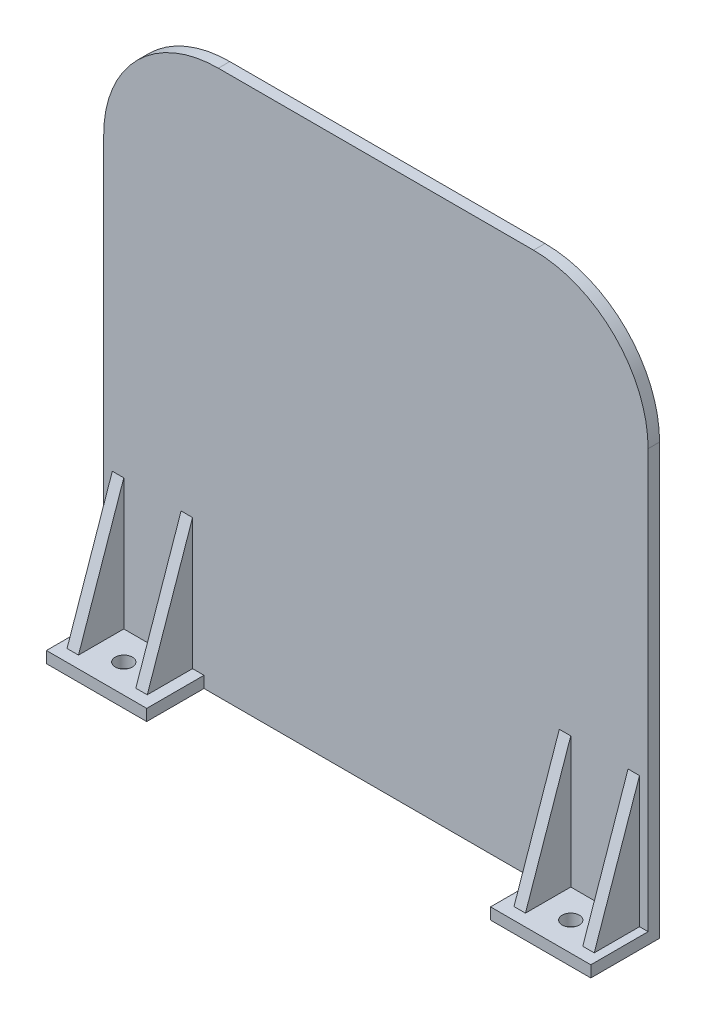
ISO-10303-21;
HEADER;
FILE_DESCRIPTION(('STEP AP214'),'2;1');
FILE_NAME('part.step','',(''),(''),'','','');
FILE_SCHEMA(('AUTOMOTIVE_DESIGN { 1 0 10303 214 1 1 1 1 }'));
ENDSEC;
DATA;
#1=APPLICATION_CONTEXT('core data for automotive mechanical design processes');
#2=APPLICATION_PROTOCOL_DEFINITION('international standard','automotive_design',2000,#1);
#3=PRODUCT_CONTEXT('',#1,'mechanical');
#4=PRODUCT('Part','Part','',(#3));
#5=PRODUCT_RELATED_PRODUCT_CATEGORY('part','',(#4));
#6=PRODUCT_DEFINITION_FORMATION('','',#4);
#7=PRODUCT_DEFINITION_CONTEXT('part definition',#1,'design');
#8=PRODUCT_DEFINITION('design','',#6,#7);
#9=PRODUCT_DEFINITION_SHAPE('','',#8);
#10=(LENGTH_UNIT() NAMED_UNIT(*) SI_UNIT(.MILLI.,.METRE.));
#11=(NAMED_UNIT(*) PLANE_ANGLE_UNIT() SI_UNIT($,.RADIAN.));
#12=(NAMED_UNIT(*) SI_UNIT($,.STERADIAN.) SOLID_ANGLE_UNIT());
#13=UNCERTAINTY_MEASURE_WITH_UNIT(LENGTH_MEASURE(1.E-05),#10,'distance_accuracy_value','');
#14=(GEOMETRIC_REPRESENTATION_CONTEXT(3) GLOBAL_UNCERTAINTY_ASSIGNED_CONTEXT((#13)) GLOBAL_UNIT_ASSIGNED_CONTEXT((#10,
#11,#12)) REPRESENTATION_CONTEXT('',''));
#15=CARTESIAN_POINT('',(0.,0.,0.));
#16=DIRECTION('',(0.,0.,1.));
#17=DIRECTION('',(1.,0.,0.));
#18=AXIS2_PLACEMENT_3D('',#15,#16,#17);
#19=CARTESIAN_POINT('',(0.,0.,2.));
#20=DIRECTION('',(0.,0.,-1.));
#21=DIRECTION('',(-1.,0.,0.));
#22=AXIS2_PLACEMENT_3D('',#19,#20,#21);
#23=PLANE('',#22);
#24=DIRECTION('',(0.,-1.,0.));
#25=VECTOR('',#24,1.);
#26=CARTESIAN_POINT('',(-46.,0.,2.));
#27=LINE('',#26,#25);
#28=CARTESIAN_POINT('',(-46.,-22.6587763218544,2.));
#29=VERTEX_POINT('',#28);
#30=CARTESIAN_POINT('',(-46.,-45.5,2.));
#31=VERTEX_POINT('',#30);
#32=EDGE_CURVE('E200',#29,#31,#27,.T.);
#33=ORIENTED_EDGE('',*,*,#32,.F.);
#34=DIRECTION('',(1.,0.,0.));
#35=VECTOR('',#34,1.);
#36=CARTESIAN_POINT('',(0.,-22.6587763218544,2.));
#37=LINE('',#36,#35);
#38=CARTESIAN_POINT('',(-44.,-22.6587763218544,2.));
#39=VERTEX_POINT('',#38);
#40=EDGE_CURVE('E206',#29,#39,#37,.T.);
#41=ORIENTED_EDGE('',*,*,#40,.T.);
#42=DIRECTION('',(0.,-1.,0.));
#43=VECTOR('',#42,1.);
#44=CARTESIAN_POINT('',(-44.,0.,2.));
#45=LINE('',#44,#43);
#46=CARTESIAN_POINT('',(-44.,-45.5,2.));
#47=VERTEX_POINT('',#46);
#48=EDGE_CURVE('E192',#39,#47,#45,.T.);
#49=ORIENTED_EDGE('',*,*,#48,.T.);
#50=DIRECTION('',(-1.,0.,0.));
#51=VECTOR('',#50,1.);
#52=CARTESIAN_POINT('',(-47.5,-45.5,2.));
#53=LINE('',#52,#51);
#54=CARTESIAN_POINT('',(-34.,-45.5,2.));
#55=VERTEX_POINT('',#54);
#56=EDGE_CURVE('E374',#55,#47,#53,.T.);
#57=ORIENTED_EDGE('',*,*,#56,.F.);
#58=DIRECTION('',(0.,-1.,0.));
#59=VECTOR('',#58,1.);
#60=CARTESIAN_POINT('',(-34.,0.,2.));
#61=LINE('',#60,#59);
#62=CARTESIAN_POINT('',(-34.,-22.6587763218544,2.));
#63=VERTEX_POINT('',#62);
#64=EDGE_CURVE('E223',#63,#55,#61,.T.);
#65=ORIENTED_EDGE('',*,*,#64,.F.);
#66=DIRECTION('',(1.,0.,0.));
#67=VECTOR('',#66,1.);
#68=CARTESIAN_POINT('',(0.,-22.6587763218544,2.));
#69=LINE('',#68,#67);
#70=CARTESIAN_POINT('',(-32.,-22.6587763218544,2.));
#71=VERTEX_POINT('',#70);
#72=EDGE_CURVE('E225',#63,#71,#69,.T.);
#73=ORIENTED_EDGE('',*,*,#72,.T.);
#74=DIRECTION('',(0.,-1.,0.));
#75=VECTOR('',#74,1.);
#76=CARTESIAN_POINT('',(-32.,0.,2.));
#77=LINE('',#76,#75);
#78=CARTESIAN_POINT('',(-32.,-45.5,2.));
#79=VERTEX_POINT('',#78);
#80=EDGE_CURVE('E219',#71,#79,#77,.T.);
#81=ORIENTED_EDGE('',*,*,#80,.T.);
#82=CARTESIAN_POINT('',(-30.,-45.5,2.));
#83=VERTEX_POINT('',#82);
#84=EDGE_CURVE('E297',#83,#79,#53,.T.);
#85=ORIENTED_EDGE('',*,*,#84,.F.);
#86=DIRECTION('',(0.,1.,0.));
#87=VECTOR('',#86,1.);
#88=CARTESIAN_POINT('',(-30.,-47.5,2.));
#89=LINE('',#88,#87);
#90=CARTESIAN_POINT('',(-30.,-47.5,2.));
#91=VERTEX_POINT('',#90);
#92=EDGE_CURVE('E265',#91,#83,#89,.T.);
#93=ORIENTED_EDGE('',*,*,#92,.F.);
#94=DIRECTION('',(-1.,0.,0.));
#95=VECTOR('',#94,1.);
#96=CARTESIAN_POINT('',(0.,-47.5,2.));
#97=LINE('',#96,#95);
#98=CARTESIAN_POINT('',(30.,-47.5,2.));
#99=VERTEX_POINT('',#98);
#100=EDGE_CURVE('E256',#99,#91,#97,.T.);
#101=ORIENTED_EDGE('',*,*,#100,.F.);
#102=DIRECTION('',(0.,1.,0.));
#103=VECTOR('',#102,1.);
#104=CARTESIAN_POINT('',(30.,-47.5,2.));
#105=LINE('',#104,#103);
#106=CARTESIAN_POINT('',(30.,-45.5,2.));
#107=VERTEX_POINT('',#106);
#108=EDGE_CURVE('E269',#99,#107,#105,.T.);
#109=ORIENTED_EDGE('',*,*,#108,.T.);
#110=CARTESIAN_POINT('',(32.,-45.5,2.));
#111=VERTEX_POINT('',#110);
#112=EDGE_CURVE('E377',#111,#107,#53,.T.);
#113=ORIENTED_EDGE('',*,*,#112,.F.);
#114=DIRECTION('',(0.,1.,0.));
#115=VECTOR('',#114,1.);
#116=CARTESIAN_POINT('',(32.,0.,2.));
#117=LINE('',#116,#115);
#118=CARTESIAN_POINT('',(32.,-22.6587763218544,2.));
#119=VERTEX_POINT('',#118);
#120=EDGE_CURVE('E346',#111,#119,#117,.T.);
#121=ORIENTED_EDGE('',*,*,#120,.T.);
#122=DIRECTION('',(-1.,0.,0.));
#123=VECTOR('',#122,1.);
#124=CARTESIAN_POINT('',(0.,-22.6587763218544,2.));
#125=LINE('',#124,#123);
#126=CARTESIAN_POINT('',(34.,-22.6587763218544,2.));
#127=VERTEX_POINT('',#126);
#128=EDGE_CURVE('E349',#127,#119,#125,.T.);
#129=ORIENTED_EDGE('',*,*,#128,.F.);
#130=DIRECTION('',(0.,1.,0.));
#131=VECTOR('',#130,1.);
#132=CARTESIAN_POINT('',(34.,0.,2.));
#133=LINE('',#132,#131);
#134=CARTESIAN_POINT('',(34.,-45.5,2.));
#135=VERTEX_POINT('',#134);
#136=EDGE_CURVE('E352',#135,#127,#133,.T.);
#137=ORIENTED_EDGE('',*,*,#136,.F.);
#138=CARTESIAN_POINT('',(44.,-45.5,2.));
#139=VERTEX_POINT('',#138);
#140=EDGE_CURVE('E296',#139,#135,#53,.T.);
#141=ORIENTED_EDGE('',*,*,#140,.F.);
#142=DIRECTION('',(0.,1.,0.));
#143=VECTOR('',#142,1.);
#144=CARTESIAN_POINT('',(44.,0.,2.));
#145=LINE('',#144,#143);
#146=CARTESIAN_POINT('',(44.,-22.6587763218544,2.));
#147=VERTEX_POINT('',#146);
#148=EDGE_CURVE('E354',#139,#147,#145,.T.);
#149=ORIENTED_EDGE('',*,*,#148,.T.);
#150=DIRECTION('',(-1.,0.,0.));
#151=VECTOR('',#150,1.);
#152=CARTESIAN_POINT('',(0.,-22.6587763218544,2.));
#153=LINE('',#152,#151);
#154=CARTESIAN_POINT('',(46.,-22.6587763218544,2.));
#155=VERTEX_POINT('',#154);
#156=EDGE_CURVE('E357',#155,#147,#153,.T.);
#157=ORIENTED_EDGE('',*,*,#156,.F.);
#158=DIRECTION('',(0.,1.,0.));
#159=VECTOR('',#158,1.);
#160=CARTESIAN_POINT('',(46.,0.,2.));
#161=LINE('',#160,#159);
#162=CARTESIAN_POINT('',(46.,-45.5,2.));
#163=VERTEX_POINT('',#162);
#164=EDGE_CURVE('E360',#163,#155,#161,.T.);
#165=ORIENTED_EDGE('',*,*,#164,.F.);
#166=CARTESIAN_POINT('',(47.5,-45.5,2.));
#167=VERTEX_POINT('',#166);
#168=EDGE_CURVE('E283',#167,#163,#53,.T.);
#169=ORIENTED_EDGE('',*,*,#168,.F.);
#170=DIRECTION('',(0.,1.,0.));
#171=VECTOR('',#170,1.);
#172=CARTESIAN_POINT('',(47.5,-47.5,2.));
#173=LINE('',#172,#171);
#174=CARTESIAN_POINT('',(47.5,27.5,2.));
#175=VERTEX_POINT('',#174);
#176=EDGE_CURVE('E304',#167,#175,#173,.T.);
#177=ORIENTED_EDGE('',*,*,#176,.T.);
#178=CARTESIAN_POINT('',(27.5,27.5,2.));
#179=DIRECTION('',(0.,0.,-1.));
#180=DIRECTION('',(-1.,0.,0.));
#181=AXIS2_PLACEMENT_3D('',#178,#179,#180);
#182=CIRCLE('',#181,20.);
#183=CARTESIAN_POINT('',(27.5,47.5,2.));
#184=VERTEX_POINT('',#183);
#185=EDGE_CURVE('E341',#175,#184,#182,.F.);
#186=ORIENTED_EDGE('',*,*,#185,.T.);
#187=DIRECTION('',(-1.,0.,0.));
#188=VECTOR('',#187,1.);
#189=CARTESIAN_POINT('',(-47.5,47.5,2.));
#190=LINE('',#189,#188);
#191=CARTESIAN_POINT('',(-27.5,47.5,2.));
#192=VERTEX_POINT('',#191);
#193=EDGE_CURVE('E307',#184,#192,#190,.T.);
#194=ORIENTED_EDGE('',*,*,#193,.T.);
#195=CARTESIAN_POINT('',(-27.5,27.5,2.));
#196=DIRECTION('',(0.,0.,-1.));
#197=DIRECTION('',(-1.,0.,0.));
#198=AXIS2_PLACEMENT_3D('',#195,#196,#197);
#199=CIRCLE('',#198,20.);
#200=CARTESIAN_POINT('',(-47.5,27.5,2.));
#201=VERTEX_POINT('',#200);
#202=EDGE_CURVE('E339',#192,#201,#199,.F.);
#203=ORIENTED_EDGE('',*,*,#202,.T.);
#204=DIRECTION('',(0.,-1.,0.));
#205=VECTOR('',#204,1.);
#206=CARTESIAN_POINT('',(-47.5,-47.5,2.));
#207=LINE('',#206,#205);
#208=CARTESIAN_POINT('',(-47.5,-45.5,2.));
#209=VERTEX_POINT('',#208);
#210=EDGE_CURVE('E311',#201,#209,#207,.T.);
#211=ORIENTED_EDGE('',*,*,#210,.T.);
#212=EDGE_CURVE('E272',#31,#209,#53,.T.);
#213=ORIENTED_EDGE('',*,*,#212,.F.);
#214=EDGE_LOOP('',(#33,#41,#49,#57,#65,#73,#81,#85,#93,#101,#109,#113,#121,#129,#137,#141,#149,
#157,#165,#169,#177,#186,#194,#203,#211,#213));
#215=FACE_BOUND('',#214,.T.);
#216=ADVANCED_FACE('F34',(#215),#23,.F.);
#217=CARTESIAN_POINT('',(-47.5,-45.5,12.));
#218=DIRECTION('',(0.,-1.,0.));
#219=DIRECTION('',(0.,0.,-1.));
#220=AXIS2_PLACEMENT_3D('',#217,#218,#219);
#221=PLANE('',#220);
#222=CARTESIAN_POINT('',(-39.,-45.5,7.));
#223=DIRECTION('',(0.,1.,0.));
#224=DIRECTION('',(0.,0.,1.));
#225=AXIS2_PLACEMENT_3D('',#222,#223,#224);
#226=CIRCLE('',#225,1.5);
#227=CARTESIAN_POINT('',(-39.,-45.5,8.5));
#228=VERTEX_POINT('',#227);
#229=EDGE_CURVE('E595',#228,#228,#226,.T.);
#230=ORIENTED_EDGE('',*,*,#229,.F.);
#231=EDGE_LOOP('',(#230));
#232=FACE_BOUND('',#231,.T.);
#233=DIRECTION('',(0.,0.,1.));
#234=VECTOR('',#233,1.);
#235=CARTESIAN_POINT('',(-46.,-45.5,12.));
#236=LINE('',#235,#234);
#237=CARTESIAN_POINT('',(-46.,-45.5,9.9047313299132));
#238=VERTEX_POINT('',#237);
#239=EDGE_CURVE('E11',#31,#238,#236,.T.);
#240=ORIENTED_EDGE('',*,*,#239,.F.);
#241=ORIENTED_EDGE('',*,*,#212,.T.);
#242=DIRECTION('',(0.,0.,-1.));
#243=VECTOR('',#242,1.);
#244=CARTESIAN_POINT('',(-47.5,-45.5,12.));
#245=LINE('',#244,#243);
#246=CARTESIAN_POINT('',(-47.5,-45.5,12.));
#247=VERTEX_POINT('',#246);
#248=EDGE_CURVE('E293',#247,#209,#245,.T.);
#249=ORIENTED_EDGE('',*,*,#248,.F.);
#250=DIRECTION('',(-1.,0.,0.));
#251=VECTOR('',#250,1.);
#252=CARTESIAN_POINT('',(-47.5,-45.5,12.));
#253=LINE('',#252,#251);
#254=CARTESIAN_POINT('',(-30.,-45.5,12.));
#255=VERTEX_POINT('',#254);
#256=EDGE_CURVE('E289',#255,#247,#253,.T.);
#257=ORIENTED_EDGE('',*,*,#256,.F.);
#258=DIRECTION('',(0.,0.,1.));
#259=VECTOR('',#258,1.);
#260=CARTESIAN_POINT('',(-30.,-45.5,0.));
#261=LINE('',#260,#259);
#262=EDGE_CURVE('E255',#83,#255,#261,.T.);
#263=ORIENTED_EDGE('',*,*,#262,.F.);
#264=ORIENTED_EDGE('',*,*,#84,.T.);
#265=DIRECTION('',(0.,0.,1.));
#266=VECTOR('',#265,1.);
#267=CARTESIAN_POINT('',(-32.,-45.5,12.));
#268=LINE('',#267,#266);
#269=CARTESIAN_POINT('',(-32.,-45.5,9.9047313299132));
#270=VERTEX_POINT('',#269);
#271=EDGE_CURVE('E362',#79,#270,#268,.T.);
#272=ORIENTED_EDGE('',*,*,#271,.T.);
#273=DIRECTION('',(-1.,0.,0.));
#274=VECTOR('',#273,1.);
#275=CARTESIAN_POINT('',(-47.5,-45.5,9.9047313299132));
#276=LINE('',#275,#274);
#277=CARTESIAN_POINT('',(-34.,-45.5,9.9047313299132));
#278=VERTEX_POINT('',#277);
#279=EDGE_CURVE('E365',#270,#278,#276,.T.);
#280=ORIENTED_EDGE('',*,*,#279,.T.);
#281=DIRECTION('',(0.,0.,1.));
#282=VECTOR('',#281,1.);
#283=CARTESIAN_POINT('',(-34.,-45.5,12.));
#284=LINE('',#283,#282);
#285=EDGE_CURVE('E368',#55,#278,#284,.T.);
#286=ORIENTED_EDGE('',*,*,#285,.F.);
#287=ORIENTED_EDGE('',*,*,#56,.T.);
#288=DIRECTION('',(0.,0.,1.));
#289=VECTOR('',#288,1.);
#290=CARTESIAN_POINT('',(-44.,-45.5,12.));
#291=LINE('',#290,#289);
#292=CARTESIAN_POINT('',(-44.,-45.5,9.9047313299132));
#293=VERTEX_POINT('',#292);
#294=EDGE_CURVE('E195',#47,#293,#291,.T.);
#295=ORIENTED_EDGE('',*,*,#294,.T.);
#296=DIRECTION('',(-1.,0.,0.));
#297=VECTOR('',#296,1.);
#298=CARTESIAN_POINT('',(-47.5,-45.5,9.9047313299132));
#299=LINE('',#298,#297);
#300=EDGE_CURVE('E42',#293,#238,#299,.T.);
#301=ORIENTED_EDGE('',*,*,#300,.T.);
#302=EDGE_LOOP('',(#240,#241,#249,#257,#263,#264,#272,#280,#286,#287,#295,#301));
#303=FACE_BOUND('',#302,.T.);
#304=ADVANCED_FACE('F372',(#232,#303),#221,.F.);
#305=CARTESIAN_POINT('',(39.,-45.5,6.99999999999999));
#306=DIRECTION('',(0.,1.,0.));
#307=DIRECTION('',(0.,0.,-1.));
#308=AXIS2_PLACEMENT_3D('',#305,#306,#307);
#309=CIRCLE('',#308,1.5);
#310=CARTESIAN_POINT('',(39.,-45.5,5.49999999999999));
#311=VERTEX_POINT('',#310);
#312=EDGE_CURVE('E600',#311,#311,#309,.T.);
#313=ORIENTED_EDGE('',*,*,#312,.F.);
#314=EDGE_LOOP('',(#313));
#315=FACE_BOUND('',#314,.T.);
#316=DIRECTION('',(0.,0.,-1.));
#317=VECTOR('',#316,1.);
#318=CARTESIAN_POINT('',(46.,-45.5,12.));
#319=LINE('',#318,#317);
#320=CARTESIAN_POINT('',(46.,-45.5,9.9047313299132));
#321=VERTEX_POINT('',#320);
#322=EDGE_CURVE('E237',#321,#163,#319,.T.);
#323=ORIENTED_EDGE('',*,*,#322,.F.);
#324=DIRECTION('',(1.,0.,0.));
#325=VECTOR('',#324,1.);
#326=CARTESIAN_POINT('',(-47.5,-45.5,9.9047313299132));
#327=LINE('',#326,#325);
#328=CARTESIAN_POINT('',(44.,-45.5,9.9047313299132));
#329=VERTEX_POINT('',#328);
#330=EDGE_CURVE('E239',#329,#321,#327,.T.);
#331=ORIENTED_EDGE('',*,*,#330,.F.);
#332=DIRECTION('',(0.,0.,-1.));
#333=VECTOR('',#332,1.);
#334=CARTESIAN_POINT('',(44.,-45.5,12.));
#335=LINE('',#334,#333);
#336=EDGE_CURVE('E232',#329,#139,#335,.T.);
#337=ORIENTED_EDGE('',*,*,#336,.T.);
#338=ORIENTED_EDGE('',*,*,#140,.T.);
#339=DIRECTION('',(0.,0.,-1.));
#340=VECTOR('',#339,1.);
#341=CARTESIAN_POINT('',(34.,-45.5,12.));
#342=LINE('',#341,#340);
#343=CARTESIAN_POINT('',(34.,-45.5,9.9047313299132));
#344=VERTEX_POINT('',#343);
#345=EDGE_CURVE('E250',#344,#135,#342,.T.);
#346=ORIENTED_EDGE('',*,*,#345,.F.);
#347=DIRECTION('',(1.,0.,0.));
#348=VECTOR('',#347,1.);
#349=CARTESIAN_POINT('',(-47.5,-45.5,9.9047313299132));
#350=LINE('',#349,#348);
#351=CARTESIAN_POINT('',(32.,-45.5,9.9047313299132));
#352=VERTEX_POINT('',#351);
#353=EDGE_CURVE('E253',#352,#344,#350,.T.);
#354=ORIENTED_EDGE('',*,*,#353,.F.);
#355=DIRECTION('',(0.,0.,-1.));
#356=VECTOR('',#355,1.);
#357=CARTESIAN_POINT('',(32.,-45.5,12.));
#358=LINE('',#357,#356);
#359=EDGE_CURVE('E245',#352,#111,#358,.T.);
#360=ORIENTED_EDGE('',*,*,#359,.T.);
#361=ORIENTED_EDGE('',*,*,#112,.T.);
#362=DIRECTION('',(0.,0.,1.));
#363=VECTOR('',#362,1.);
#364=CARTESIAN_POINT('',(30.,-45.5,0.));
#365=LINE('',#364,#363);
#366=CARTESIAN_POINT('',(30.,-45.5,12.));
#367=VERTEX_POINT('',#366);
#368=EDGE_CURVE('E260',#107,#367,#365,.T.);
#369=ORIENTED_EDGE('',*,*,#368,.T.);
#370=CARTESIAN_POINT('',(47.5,-45.5,12.));
#371=VERTEX_POINT('',#370);
#372=EDGE_CURVE('E290',#371,#367,#253,.T.);
#373=ORIENTED_EDGE('',*,*,#372,.F.);
#374=DIRECTION('',(0.,0.,-1.));
#375=VECTOR('',#374,1.);
#376=CARTESIAN_POINT('',(47.5,-45.5,12.));
#377=LINE('',#376,#375);
#378=EDGE_CURVE('E300',#371,#167,#377,.T.);
#379=ORIENTED_EDGE('',*,*,#378,.T.);
#380=ORIENTED_EDGE('',*,*,#168,.T.);
#381=EDGE_LOOP('',(#323,#331,#337,#338,#346,#354,#360,#361,#369,#373,#379,#380));
#382=FACE_BOUND('',#381,.T.);
#383=ADVANCED_FACE('F383',(#315,#382),#221,.F.);
#384=CARTESIAN_POINT('',(-47.5,-47.5,2.));
#385=DIRECTION('',(0.,1.,0.));
#386=DIRECTION('',(0.,0.,1.));
#387=AXIS2_PLACEMENT_3D('',#384,#385,#386);
#388=PLANE('',#387);
#389=CARTESIAN_POINT('',(-39.,-47.5,7.));
#390=DIRECTION('',(0.,1.,0.));
#391=DIRECTION('',(0.,0.,1.));
#392=AXIS2_PLACEMENT_3D('',#389,#390,#391);
#393=CIRCLE('',#392,1.5);
#394=CARTESIAN_POINT('',(-39.,-47.5,8.5));
#395=VERTEX_POINT('',#394);
#396=EDGE_CURVE('E209',#395,#395,#393,.T.);
#397=ORIENTED_EDGE('',*,*,#396,.T.);
#398=EDGE_LOOP('',(#397));
#399=FACE_BOUND('',#398,.T.);
#400=CARTESIAN_POINT('',(39.,-47.5,6.99999999999999));
#401=DIRECTION('',(0.,1.,0.));
#402=DIRECTION('',(0.,0.,-1.));
#403=AXIS2_PLACEMENT_3D('',#400,#401,#402);
#404=CIRCLE('',#403,1.5);
#405=CARTESIAN_POINT('',(39.,-47.5,5.49999999999999));
#406=VERTEX_POINT('',#405);
#407=EDGE_CURVE('E596',#406,#406,#404,.T.);
#408=ORIENTED_EDGE('',*,*,#407,.T.);
#409=EDGE_LOOP('',(#408));
#410=FACE_BOUND('',#409,.T.);
#411=DIRECTION('',(0.,0.,1.));
#412=VECTOR('',#411,1.);
#413=CARTESIAN_POINT('',(30.,-47.5,0.));
#414=LINE('',#413,#412);
#415=CARTESIAN_POINT('',(30.,-47.5,12.));
#416=VERTEX_POINT('',#415);
#417=EDGE_CURVE('E263',#99,#416,#414,.T.);
#418=ORIENTED_EDGE('',*,*,#417,.F.);
#419=ORIENTED_EDGE('',*,*,#100,.T.);
#420=DIRECTION('',(0.,0.,1.));
#421=VECTOR('',#420,1.);
#422=CARTESIAN_POINT('',(-30.,-47.5,0.));
#423=LINE('',#422,#421);
#424=CARTESIAN_POINT('',(-30.,-47.5,12.));
#425=VERTEX_POINT('',#424);
#426=EDGE_CURVE('E259',#91,#425,#423,.T.);
#427=ORIENTED_EDGE('',*,*,#426,.T.);
#428=DIRECTION('',(1.,0.,0.));
#429=VECTOR('',#428,1.);
#430=CARTESIAN_POINT('',(-47.5,-47.5,12.));
#431=LINE('',#430,#429);
#432=CARTESIAN_POINT('',(-47.5,-47.5,12.));
#433=VERTEX_POINT('',#432);
#434=EDGE_CURVE('E284',#433,#425,#431,.T.);
#435=ORIENTED_EDGE('',*,*,#434,.F.);
#436=DIRECTION('',(0.,0.,-1.));
#437=VECTOR('',#436,1.);
#438=CARTESIAN_POINT('',(-47.5,-47.5,2.));
#439=LINE('',#438,#437);
#440=CARTESIAN_POINT('',(-47.5,-47.5,0.));
#441=VERTEX_POINT('',#440);
#442=EDGE_CURVE('E325',#433,#441,#439,.T.);
#443=ORIENTED_EDGE('',*,*,#442,.T.);
#444=DIRECTION('',(1.,0.,0.));
#445=VECTOR('',#444,1.);
#446=CARTESIAN_POINT('',(-47.5,-47.5,0.));
#447=LINE('',#446,#445);
#448=CARTESIAN_POINT('',(47.5,-47.5,0.));
#449=VERTEX_POINT('',#448);
#450=EDGE_CURVE('E308',#441,#449,#447,.T.);
#451=ORIENTED_EDGE('',*,*,#450,.T.);
#452=DIRECTION('',(0.,0.,-1.));
#453=VECTOR('',#452,1.);
#454=CARTESIAN_POINT('',(47.5,-47.5,2.));
#455=LINE('',#454,#453);
#456=CARTESIAN_POINT('',(47.5,-47.5,12.));
#457=VERTEX_POINT('',#456);
#458=EDGE_CURVE('E314',#457,#449,#455,.T.);
#459=ORIENTED_EDGE('',*,*,#458,.F.);
#460=EDGE_CURVE('E282',#416,#457,#431,.T.);
#461=ORIENTED_EDGE('',*,*,#460,.F.);
#462=EDGE_LOOP('',(#418,#419,#427,#435,#443,#451,#459,#461));
#463=FACE_BOUND('',#462,.T.);
#464=ADVANCED_FACE('F397',(#399,#410,#463),#388,.F.);
#465=CARTESIAN_POINT('',(0.,0.,12.));
#466=DIRECTION('',(0.,0.,-1.));
#467=DIRECTION('',(-1.,0.,0.));
#468=AXIS2_PLACEMENT_3D('',#465,#466,#467);
#469=PLANE('',#468);
#470=DIRECTION('',(0.,1.,0.));
#471=VECTOR('',#470,1.);
#472=CARTESIAN_POINT('',(30.,-47.5,12.));
#473=LINE('',#472,#471);
#474=EDGE_CURVE('E273',#416,#367,#473,.T.);
#475=ORIENTED_EDGE('',*,*,#474,.F.);
#476=ORIENTED_EDGE('',*,*,#460,.T.);
#477=DIRECTION('',(0.,1.,0.));
#478=VECTOR('',#477,1.);
#479=CARTESIAN_POINT('',(47.5,-47.5,12.));
#480=LINE('',#479,#478);
#481=EDGE_CURVE('E287',#457,#371,#480,.T.);
#482=ORIENTED_EDGE('',*,*,#481,.T.);
#483=ORIENTED_EDGE('',*,*,#372,.T.);
#484=EDGE_LOOP('',(#475,#476,#482,#483));
#485=FACE_BOUND('',#484,.T.);
#486=ADVANCED_FACE('F394',(#485),#469,.F.);
#487=CARTESIAN_POINT('',(47.5,-47.5,2.));
#488=DIRECTION('',(-1.,0.,0.));
#489=DIRECTION('',(0.,0.,1.));
#490=AXIS2_PLACEMENT_3D('',#487,#488,#489);
#491=PLANE('',#490);
#492=DIRECTION('',(0.,1.,0.));
#493=VECTOR('',#492,1.);
#494=CARTESIAN_POINT('',(47.5,-47.5,0.));
#495=LINE('',#494,#493);
#496=CARTESIAN_POINT('',(47.5,27.5,0.));
#497=VERTEX_POINT('',#496);
#498=EDGE_CURVE('E303',#449,#497,#495,.T.);
#499=ORIENTED_EDGE('',*,*,#498,.T.);
#500=DIRECTION('',(0.,0.,-1.));
#501=VECTOR('',#500,1.);
#502=CARTESIAN_POINT('',(47.5,27.5,2.));
#503=LINE('',#502,#501);
#504=EDGE_CURVE('E337',#497,#175,#503,.F.);
#505=ORIENTED_EDGE('',*,*,#504,.T.);
#506=ORIENTED_EDGE('',*,*,#176,.F.);
#507=ORIENTED_EDGE('',*,*,#378,.F.);
#508=ORIENTED_EDGE('',*,*,#481,.F.);
#509=ORIENTED_EDGE('',*,*,#458,.T.);
#510=EDGE_LOOP('',(#499,#505,#506,#507,#508,#509));
#511=FACE_BOUND('',#510,.T.);
#512=ADVANCED_FACE('F403',(#511),#491,.F.);
#513=CARTESIAN_POINT('',(-47.5,47.5,2.));
#514=DIRECTION('',(0.,-1.,0.));
#515=DIRECTION('',(0.,0.,-1.));
#516=AXIS2_PLACEMENT_3D('',#513,#514,#515);
#517=PLANE('',#516);
#518=ORIENTED_EDGE('',*,*,#193,.F.);
#519=DIRECTION('',(0.,0.,-1.));
#520=VECTOR('',#519,1.);
#521=CARTESIAN_POINT('',(27.5,47.5,2.));
#522=LINE('',#521,#520);
#523=CARTESIAN_POINT('',(27.5,47.5,0.));
#524=VERTEX_POINT('',#523);
#525=EDGE_CURVE('E330',#184,#524,#522,.T.);
#526=ORIENTED_EDGE('',*,*,#525,.T.);
#527=DIRECTION('',(-1.,0.,0.));
#528=VECTOR('',#527,1.);
#529=CARTESIAN_POINT('',(-47.5,47.5,0.));
#530=LINE('',#529,#528);
#531=CARTESIAN_POINT('',(-27.5,47.5,0.));
#532=VERTEX_POINT('',#531);
#533=EDGE_CURVE('E317',#524,#532,#530,.T.);
#534=ORIENTED_EDGE('',*,*,#533,.T.);
#535=DIRECTION('',(0.,0.,-1.));
#536=VECTOR('',#535,1.);
#537=CARTESIAN_POINT('',(-27.5,47.5,2.));
#538=LINE('',#537,#536);
#539=EDGE_CURVE('E328',#532,#192,#538,.F.);
#540=ORIENTED_EDGE('',*,*,#539,.T.);
#541=EDGE_LOOP('',(#518,#526,#534,#540));
#542=FACE_BOUND('',#541,.T.);
#543=ADVANCED_FACE('F454',(#542),#517,.F.);
#544=CARTESIAN_POINT('',(-47.5,-47.5,2.));
#545=DIRECTION('',(1.,0.,0.));
#546=DIRECTION('',(0.,0.,-1.));
#547=AXIS2_PLACEMENT_3D('',#544,#545,#546);
#548=PLANE('',#547);
#549=ORIENTED_EDGE('',*,*,#210,.F.);
#550=DIRECTION('',(0.,0.,-1.));
#551=VECTOR('',#550,1.);
#552=CARTESIAN_POINT('',(-47.5,27.5,2.));
#553=LINE('',#552,#551);
#554=CARTESIAN_POINT('',(-47.5,27.5,0.));
#555=VERTEX_POINT('',#554);
#556=EDGE_CURVE('E343',#201,#555,#553,.T.);
#557=ORIENTED_EDGE('',*,*,#556,.T.);
#558=DIRECTION('',(0.,-1.,0.));
#559=VECTOR('',#558,1.);
#560=CARTESIAN_POINT('',(-47.5,-47.5,0.));
#561=LINE('',#560,#559);
#562=EDGE_CURVE('E320',#555,#441,#561,.T.);
#563=ORIENTED_EDGE('',*,*,#562,.T.);
#564=ORIENTED_EDGE('',*,*,#442,.F.);
#565=DIRECTION('',(0.,-1.,0.));
#566=VECTOR('',#565,1.);
#567=CARTESIAN_POINT('',(-47.5,-47.5,12.));
#568=LINE('',#567,#566);
#569=EDGE_CURVE('E279',#247,#433,#568,.T.);
#570=ORIENTED_EDGE('',*,*,#569,.F.);
#571=ORIENTED_EDGE('',*,*,#248,.T.);
#572=EDGE_LOOP('',(#549,#557,#563,#564,#570,#571));
#573=FACE_BOUND('',#572,.T.);
#574=ADVANCED_FACE('F447',(#573),#548,.F.);
#575=CARTESIAN_POINT('',(0.,0.,0.));
#576=DIRECTION('',(0.,0.,-1.));
#577=DIRECTION('',(-1.,0.,0.));
#578=AXIS2_PLACEMENT_3D('',#575,#576,#577);
#579=PLANE('',#578);
#580=ORIENTED_EDGE('',*,*,#533,.F.);
#581=CARTESIAN_POINT('',(27.5,27.5,0.));
#582=DIRECTION('',(0.,0.,-1.));
#583=DIRECTION('',(-1.,0.,0.));
#584=AXIS2_PLACEMENT_3D('',#581,#582,#583);
#585=CIRCLE('',#584,20.);
#586=EDGE_CURVE('E335',#524,#497,#585,.T.);
#587=ORIENTED_EDGE('',*,*,#586,.T.);
#588=ORIENTED_EDGE('',*,*,#498,.F.);
#589=ORIENTED_EDGE('',*,*,#450,.F.);
#590=ORIENTED_EDGE('',*,*,#562,.F.);
#591=CARTESIAN_POINT('',(-27.5,27.5,0.));
#592=DIRECTION('',(0.,0.,-1.));
#593=DIRECTION('',(-1.,0.,0.));
#594=AXIS2_PLACEMENT_3D('',#591,#592,#593);
#595=CIRCLE('',#594,20.);
#596=EDGE_CURVE('E333',#555,#532,#595,.T.);
#597=ORIENTED_EDGE('',*,*,#596,.T.);
#598=EDGE_LOOP('',(#580,#587,#588,#589,#590,#597));
#599=FACE_BOUND('',#598,.T.);
#600=ADVANCED_FACE('F443',(#599),#579,.T.);
#601=ORIENTED_EDGE('',*,*,#434,.T.);
#602=DIRECTION('',(0.,1.,0.));
#603=VECTOR('',#602,1.);
#604=CARTESIAN_POINT('',(-30.,-47.5,12.));
#605=LINE('',#604,#603);
#606=EDGE_CURVE('E275',#425,#255,#605,.T.);
#607=ORIENTED_EDGE('',*,*,#606,.T.);
#608=ORIENTED_EDGE('',*,*,#256,.T.);
#609=ORIENTED_EDGE('',*,*,#569,.T.);
#610=EDGE_LOOP('',(#601,#607,#608,#609));
#611=FACE_BOUND('',#610,.T.);
#612=ADVANCED_FACE('F446',(#611),#469,.F.);
#613=CARTESIAN_POINT('',(27.5,27.5,2.));
#614=DIRECTION('',(0.,0.,-1.));
#615=DIRECTION('',(-1.,0.,0.));
#616=AXIS2_PLACEMENT_3D('',#613,#614,#615);
#617=CYLINDRICAL_SURFACE('',#616,20.);
#618=ORIENTED_EDGE('',*,*,#185,.F.);
#619=ORIENTED_EDGE('',*,*,#504,.F.);
#620=ORIENTED_EDGE('',*,*,#586,.F.);
#621=ORIENTED_EDGE('',*,*,#525,.F.);
#622=EDGE_LOOP('',(#618,#619,#620,#621));
#623=FACE_BOUND('',#622,.T.);
#624=ADVANCED_FACE('F460',(#623),#617,.T.);
#625=CARTESIAN_POINT('',(-27.5,27.5,2.));
#626=DIRECTION('',(0.,0.,-1.));
#627=DIRECTION('',(-1.,0.,0.));
#628=AXIS2_PLACEMENT_3D('',#625,#626,#627);
#629=CYLINDRICAL_SURFACE('',#628,20.);
#630=ORIENTED_EDGE('',*,*,#202,.F.);
#631=ORIENTED_EDGE('',*,*,#539,.F.);
#632=ORIENTED_EDGE('',*,*,#596,.F.);
#633=ORIENTED_EDGE('',*,*,#556,.F.);
#634=EDGE_LOOP('',(#630,#631,#632,#633));
#635=FACE_BOUND('',#634,.T.);
#636=ADVANCED_FACE('F36',(#635),#629,.T.);
#637=CARTESIAN_POINT('',(30.,-47.5,0.));
#638=DIRECTION('',(-1.,0.,0.));
#639=DIRECTION('',(0.,0.,1.));
#640=AXIS2_PLACEMENT_3D('',#637,#638,#639);
#641=PLANE('',#640);
#642=ORIENTED_EDGE('',*,*,#368,.F.);
#643=ORIENTED_EDGE('',*,*,#108,.F.);
#644=ORIENTED_EDGE('',*,*,#417,.T.);
#645=ORIENTED_EDGE('',*,*,#474,.T.);
#646=EDGE_LOOP('',(#642,#643,#644,#645));
#647=FACE_BOUND('',#646,.T.);
#648=ADVANCED_FACE('F390',(#647),#641,.T.);
#649=CARTESIAN_POINT('',(-30.,-47.5,0.));
#650=DIRECTION('',(-1.,0.,0.));
#651=DIRECTION('',(0.,0.,1.));
#652=AXIS2_PLACEMENT_3D('',#649,#650,#651);
#653=PLANE('',#652);
#654=ORIENTED_EDGE('',*,*,#262,.T.);
#655=ORIENTED_EDGE('',*,*,#606,.F.);
#656=ORIENTED_EDGE('',*,*,#426,.F.);
#657=ORIENTED_EDGE('',*,*,#92,.T.);
#658=EDGE_LOOP('',(#654,#655,#656,#657));
#659=FACE_BOUND('',#658,.T.);
#660=ADVANCED_FACE('F486',(#659),#653,.F.);
#661=CARTESIAN_POINT('',(34.,-21.2136365533382,1.49987611148768));
#662=DIRECTION('',(0.,-0.327042357082128,-0.945009680730397));
#663=DIRECTION('',(0.,0.945009680730397,-0.327042357082128));
#664=AXIS2_PLACEMENT_3D('',#661,#662,#663);
#665=PLANE('',#664);
#666=DIRECTION('',(0.,-0.945009680730396,0.327042357082128));
#667=VECTOR('',#666,1.);
#668=CARTESIAN_POINT('',(32.,-21.2136365533382,1.49987611148768));
#669=LINE('',#668,#667);
#670=EDGE_CURVE('E241',#119,#352,#669,.T.);
#671=ORIENTED_EDGE('',*,*,#670,.T.);
#672=ORIENTED_EDGE('',*,*,#353,.T.);
#673=DIRECTION('',(0.,-0.945009680730396,0.327042357082128));
#674=VECTOR('',#673,1.);
#675=CARTESIAN_POINT('',(34.,-21.2136365533382,1.49987611148768));
#676=LINE('',#675,#674);
#677=EDGE_CURVE('E242',#127,#344,#676,.T.);
#678=ORIENTED_EDGE('',*,*,#677,.F.);
#679=ORIENTED_EDGE('',*,*,#128,.T.);
#680=EDGE_LOOP('',(#671,#672,#678,#679));
#681=FACE_BOUND('',#680,.T.);
#682=ADVANCED_FACE('F421',(#681),#665,.F.);
#683=CARTESIAN_POINT('',(34.,0.,0.));
#684=DIRECTION('',(-1.,0.,0.));
#685=DIRECTION('',(0.,0.,1.));
#686=AXIS2_PLACEMENT_3D('',#683,#684,#685);
#687=PLANE('',#686);
#688=ORIENTED_EDGE('',*,*,#677,.T.);
#689=ORIENTED_EDGE('',*,*,#345,.T.);
#690=ORIENTED_EDGE('',*,*,#136,.T.);
#691=EDGE_LOOP('',(#688,#689,#690));
#692=FACE_BOUND('',#691,.T.);
#693=ADVANCED_FACE('F419',(#692),#687,.F.);
#694=CARTESIAN_POINT('',(32.,0.,0.));
#695=DIRECTION('',(-1.,0.,0.));
#696=DIRECTION('',(0.,0.,1.));
#697=AXIS2_PLACEMENT_3D('',#694,#695,#696);
#698=PLANE('',#697);
#699=ORIENTED_EDGE('',*,*,#359,.F.);
#700=ORIENTED_EDGE('',*,*,#670,.F.);
#701=ORIENTED_EDGE('',*,*,#120,.F.);
#702=EDGE_LOOP('',(#699,#700,#701));
#703=FACE_BOUND('',#702,.T.);
#704=ADVANCED_FACE('F423',(#703),#698,.T.);
#705=CARTESIAN_POINT('',(46.,-21.2136365533382,1.49987611148768));
#706=DIRECTION('',(0.,-0.327042357082128,-0.945009680730397));
#707=DIRECTION('',(0.,0.945009680730397,-0.327042357082128));
#708=AXIS2_PLACEMENT_3D('',#705,#706,#707);
#709=PLANE('',#708);
#710=DIRECTION('',(0.,-0.945009680730396,0.327042357082128));
#711=VECTOR('',#710,1.);
#712=CARTESIAN_POINT('',(44.,-21.2136365533382,1.49987611148768));
#713=LINE('',#712,#711);
#714=EDGE_CURVE('E228',#147,#329,#713,.T.);
#715=ORIENTED_EDGE('',*,*,#714,.T.);
#716=ORIENTED_EDGE('',*,*,#330,.T.);
#717=DIRECTION('',(0.,-0.945009680730396,0.327042357082128));
#718=VECTOR('',#717,1.);
#719=CARTESIAN_POINT('',(46.,-21.2136365533382,1.49987611148768));
#720=LINE('',#719,#718);
#721=EDGE_CURVE('E229',#155,#321,#720,.T.);
#722=ORIENTED_EDGE('',*,*,#721,.F.);
#723=ORIENTED_EDGE('',*,*,#156,.T.);
#724=EDGE_LOOP('',(#715,#716,#722,#723));
#725=FACE_BOUND('',#724,.T.);
#726=ADVANCED_FACE('F413',(#725),#709,.F.);
#727=CARTESIAN_POINT('',(46.,0.,0.));
#728=DIRECTION('',(-1.,0.,0.));
#729=DIRECTION('',(0.,0.,1.));
#730=AXIS2_PLACEMENT_3D('',#727,#728,#729);
#731=PLANE('',#730);
#732=ORIENTED_EDGE('',*,*,#721,.T.);
#733=ORIENTED_EDGE('',*,*,#322,.T.);
#734=ORIENTED_EDGE('',*,*,#164,.T.);
#735=EDGE_LOOP('',(#732,#733,#734));
#736=FACE_BOUND('',#735,.T.);
#737=ADVANCED_FACE('F411',(#736),#731,.F.);
#738=CARTESIAN_POINT('',(44.,0.,0.));
#739=DIRECTION('',(-1.,0.,0.));
#740=DIRECTION('',(0.,0.,1.));
#741=AXIS2_PLACEMENT_3D('',#738,#739,#740);
#742=PLANE('',#741);
#743=ORIENTED_EDGE('',*,*,#336,.F.);
#744=ORIENTED_EDGE('',*,*,#714,.F.);
#745=ORIENTED_EDGE('',*,*,#148,.F.);
#746=EDGE_LOOP('',(#743,#744,#745));
#747=FACE_BOUND('',#746,.T.);
#748=ADVANCED_FACE('F500',(#747),#742,.T.);
#749=CARTESIAN_POINT('',(-34.,-21.2136365533382,1.49987611148768));
#750=DIRECTION('',(0.,0.327042357082128,0.945009680730397));
#751=DIRECTION('',(0.,-0.945009680730397,0.327042357082128));
#752=AXIS2_PLACEMENT_3D('',#749,#750,#751);
#753=PLANE('',#752);
#754=ORIENTED_EDGE('',*,*,#72,.F.);
#755=DIRECTION('',(0.,-0.945009680730396,0.327042357082128));
#756=VECTOR('',#755,1.);
#757=CARTESIAN_POINT('',(-34.,-21.2136365533382,1.49987611148768));
#758=LINE('',#757,#756);
#759=EDGE_CURVE('E214',#63,#278,#758,.T.);
#760=ORIENTED_EDGE('',*,*,#759,.T.);
#761=ORIENTED_EDGE('',*,*,#279,.F.);
#762=DIRECTION('',(0.,-0.945009680730396,0.327042357082128));
#763=VECTOR('',#762,1.);
#764=CARTESIAN_POINT('',(-32.,-21.2136365533382,1.49987611148768));
#765=LINE('',#764,#763);
#766=EDGE_CURVE('E57',#71,#270,#765,.T.);
#767=ORIENTED_EDGE('',*,*,#766,.F.);
#768=EDGE_LOOP('',(#754,#760,#761,#767));
#769=FACE_BOUND('',#768,.T.);
#770=ADVANCED_FACE('F489',(#769),#753,.T.);
#771=CARTESIAN_POINT('',(-34.,0.,0.));
#772=DIRECTION('',(1.,0.,0.));
#773=DIRECTION('',(0.,0.,1.));
#774=AXIS2_PLACEMENT_3D('',#771,#772,#773);
#775=PLANE('',#774);
#776=ORIENTED_EDGE('',*,*,#759,.F.);
#777=ORIENTED_EDGE('',*,*,#64,.T.);
#778=ORIENTED_EDGE('',*,*,#285,.T.);
#779=EDGE_LOOP('',(#776,#777,#778));
#780=FACE_BOUND('',#779,.T.);
#781=ADVANCED_FACE('F492',(#780),#775,.F.);
#782=CARTESIAN_POINT('',(-32.,0.,0.));
#783=DIRECTION('',(1.,0.,0.));
#784=DIRECTION('',(0.,0.,1.));
#785=AXIS2_PLACEMENT_3D('',#782,#783,#784);
#786=PLANE('',#785);
#787=ORIENTED_EDGE('',*,*,#80,.F.);
#788=ORIENTED_EDGE('',*,*,#766,.T.);
#789=ORIENTED_EDGE('',*,*,#271,.F.);
#790=EDGE_LOOP('',(#787,#788,#789));
#791=FACE_BOUND('',#790,.T.);
#792=ADVANCED_FACE('F487',(#791),#786,.T.);
#793=CARTESIAN_POINT('',(-46.,-21.2136365533382,1.49987611148768));
#794=DIRECTION('',(0.,0.327042357082128,0.945009680730397));
#795=DIRECTION('',(0.,-0.945009680730397,0.327042357082128));
#796=AXIS2_PLACEMENT_3D('',#793,#794,#795);
#797=PLANE('',#796);
#798=ORIENTED_EDGE('',*,*,#40,.F.);
#799=DIRECTION('',(0.,-0.945009680730396,0.327042357082128));
#800=VECTOR('',#799,1.);
#801=CARTESIAN_POINT('',(-46.,-21.2136365533382,1.49987611148768));
#802=LINE('',#801,#800);
#803=EDGE_CURVE('E201',#29,#238,#802,.T.);
#804=ORIENTED_EDGE('',*,*,#803,.T.);
#805=ORIENTED_EDGE('',*,*,#300,.F.);
#806=DIRECTION('',(0.,-0.945009680730396,0.327042357082128));
#807=VECTOR('',#806,1.);
#808=CARTESIAN_POINT('',(-44.,-21.2136365533382,1.49987611148768));
#809=LINE('',#808,#807);
#810=EDGE_CURVE('E49',#39,#293,#809,.T.);
#811=ORIENTED_EDGE('',*,*,#810,.F.);
#812=EDGE_LOOP('',(#798,#804,#805,#811));
#813=FACE_BOUND('',#812,.T.);
#814=ADVANCED_FACE('F204',(#813),#797,.T.);
#815=CARTESIAN_POINT('',(-46.,0.,0.));
#816=DIRECTION('',(1.,0.,0.));
#817=DIRECTION('',(0.,0.,1.));
#818=AXIS2_PLACEMENT_3D('',#815,#816,#817);
#819=PLANE('',#818);
#820=ORIENTED_EDGE('',*,*,#803,.F.);
#821=ORIENTED_EDGE('',*,*,#32,.T.);
#822=ORIENTED_EDGE('',*,*,#239,.T.);
#823=EDGE_LOOP('',(#820,#821,#822));
#824=FACE_BOUND('',#823,.T.);
#825=ADVANCED_FACE('F538',(#824),#819,.F.);
#826=CARTESIAN_POINT('',(-44.,0.,0.));
#827=DIRECTION('',(1.,0.,0.));
#828=DIRECTION('',(0.,0.,1.));
#829=AXIS2_PLACEMENT_3D('',#826,#827,#828);
#830=PLANE('',#829);
#831=ORIENTED_EDGE('',*,*,#48,.F.);
#832=ORIENTED_EDGE('',*,*,#810,.T.);
#833=ORIENTED_EDGE('',*,*,#294,.F.);
#834=EDGE_LOOP('',(#831,#832,#833));
#835=FACE_BOUND('',#834,.T.);
#836=ADVANCED_FACE('F193',(#835),#830,.T.);
#837=CARTESIAN_POINT('',(39.,-47.5,6.99999999999999));
#838=DIRECTION('',(0.,1.,0.));
#839=DIRECTION('',(0.,0.,1.));
#840=AXIS2_PLACEMENT_3D('',#837,#838,#839);
#841=CYLINDRICAL_SURFACE('',#840,1.5);
#842=ORIENTED_EDGE('',*,*,#407,.F.);
#843=EDGE_LOOP('',(#842));
#844=FACE_BOUND('',#843,.T.);
#845=ORIENTED_EDGE('',*,*,#312,.T.);
#846=EDGE_LOOP('',(#845));
#847=FACE_BOUND('',#846,.T.);
#848=ADVANCED_FACE('F554',(#844,#847),#841,.F.);
#849=CARTESIAN_POINT('',(-39.,-47.5,7.));
#850=DIRECTION('',(0.,1.,0.));
#851=DIRECTION('',(0.,0.,1.));
#852=AXIS2_PLACEMENT_3D('',#849,#850,#851);
#853=CYLINDRICAL_SURFACE('',#852,1.5);
#854=ORIENTED_EDGE('',*,*,#396,.F.);
#855=EDGE_LOOP('',(#854));
#856=FACE_BOUND('',#855,.T.);
#857=ORIENTED_EDGE('',*,*,#229,.T.);
#858=EDGE_LOOP('',(#857));
#859=FACE_BOUND('',#858,.T.);
#860=ADVANCED_FACE('F576',(#856,#859),#853,.F.);
#861=CLOSED_SHELL('',(#216,#304,#383,#464,#486,#512,#543,#574,#600,#612,#624,#636,#648,#660,
#682,#693,#704,#726,#737,#748,#770,#781,#792,#814,#825,#836,#848,#860));
#862=MANIFOLD_SOLID_BREP('B2',#861);
#863=ADVANCED_BREP_SHAPE_REPRESENTATION('',(#18,#862),#14);
#864=SHAPE_DEFINITION_REPRESENTATION(#9,#863);
ENDSEC;
END-ISO-10303-21;
